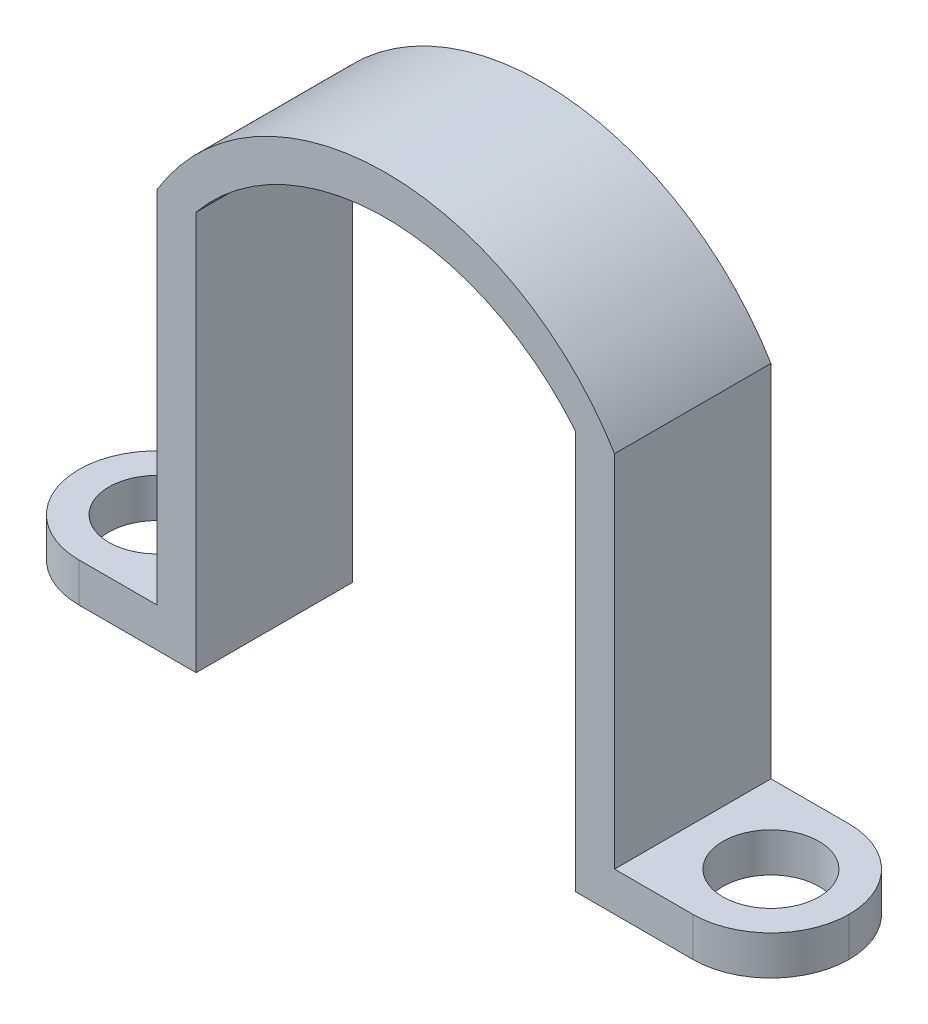
ISO-10303-21;
HEADER;
FILE_DESCRIPTION(('STEP AP214'),'2;1');
FILE_NAME('part.step','',(''),(''),'','','');
FILE_SCHEMA(('AUTOMOTIVE_DESIGN { 1 0 10303 214 1 1 1 1 }'));
ENDSEC;
DATA;
#1=APPLICATION_CONTEXT('core data for automotive mechanical design processes');
#2=APPLICATION_PROTOCOL_DEFINITION('international standard','automotive_design',2000,#1);
#3=PRODUCT_CONTEXT('',#1,'mechanical');
#4=PRODUCT('Part','Part','',(#3));
#5=PRODUCT_RELATED_PRODUCT_CATEGORY('part','',(#4));
#6=PRODUCT_DEFINITION_FORMATION('','',#4);
#7=PRODUCT_DEFINITION_CONTEXT('part definition',#1,'design');
#8=PRODUCT_DEFINITION('design','',#6,#7);
#9=PRODUCT_DEFINITION_SHAPE('','',#8);
#10=(LENGTH_UNIT() NAMED_UNIT(*) SI_UNIT(.MILLI.,.METRE.));
#11=(NAMED_UNIT(*) PLANE_ANGLE_UNIT() SI_UNIT($,.RADIAN.));
#12=(NAMED_UNIT(*) SI_UNIT($,.STERADIAN.) SOLID_ANGLE_UNIT());
#13=UNCERTAINTY_MEASURE_WITH_UNIT(LENGTH_MEASURE(1.E-05),#10,'distance_accuracy_value','');
#14=(GEOMETRIC_REPRESENTATION_CONTEXT(3) GLOBAL_UNCERTAINTY_ASSIGNED_CONTEXT((#13)) GLOBAL_UNIT_ASSIGNED_CONTEXT((#10,
#11,#12)) REPRESENTATION_CONTEXT('',''));
#15=CARTESIAN_POINT('',(0.,0.,0.));
#16=DIRECTION('',(0.,0.,1.));
#17=DIRECTION('',(1.,0.,0.));
#18=AXIS2_PLACEMENT_3D('',#15,#16,#17);
#19=CARTESIAN_POINT('',(18.669,-22.1999604842901,5.08));
#20=DIRECTION('',(0.,-1.,0.));
#21=DIRECTION('',(0.,0.,-1.));
#22=AXIS2_PLACEMENT_3D('',#19,#20,#21);
#23=PLANE('',#22);
#24=CARTESIAN_POINT('',(16.129,-22.1999604842901,2.54));
#25=DIRECTION('',(0.,1.,0.));
#26=DIRECTION('',(0.,0.,1.));
#27=AXIS2_PLACEMENT_3D('',#24,#25,#26);
#28=CIRCLE('',#27,1.5625);
#29=CARTESIAN_POINT('',(16.129,-22.1999604842901,4.1025));
#30=VERTEX_POINT('',#29);
#31=EDGE_CURVE('E247',#30,#30,#28,.T.);
#32=ORIENTED_EDGE('',*,*,#31,.F.);
#33=EDGE_LOOP('',(#32));
#34=FACE_BOUND('',#33,.T.);
#35=CARTESIAN_POINT('',(16.129,-22.1999604842901,2.54));
#36=DIRECTION('',(0.,-1.,0.));
#37=DIRECTION('',(0.,0.,-1.));
#38=AXIS2_PLACEMENT_3D('',#35,#36,#37);
#39=CIRCLE('',#38,2.54);
#40=CARTESIAN_POINT('',(16.129,-22.1999604842901,5.08));
#41=VERTEX_POINT('',#40);
#42=CARTESIAN_POINT('',(18.669,-22.1999604842901,2.54));
#43=VERTEX_POINT('',#42);
#44=EDGE_CURVE('E60',#41,#43,#39,.F.);
#45=ORIENTED_EDGE('',*,*,#44,.T.);
#46=CARTESIAN_POINT('',(16.129,-22.1999604842901,2.54));
#47=DIRECTION('',(0.,-1.,0.));
#48=DIRECTION('',(0.,0.,-1.));
#49=AXIS2_PLACEMENT_3D('',#46,#47,#48);
#50=CIRCLE('',#49,2.54);
#51=CARTESIAN_POINT('',(16.129,-22.1999604842901,0.));
#52=VERTEX_POINT('',#51);
#53=EDGE_CURVE('E236',#43,#52,#50,.F.);
#54=ORIENTED_EDGE('',*,*,#53,.T.);
#55=DIRECTION('',(-1.,0.,0.));
#56=VECTOR('',#55,1.);
#57=CARTESIAN_POINT('',(18.669,-22.1999604842901,0.));
#58=LINE('',#57,#56);
#59=CARTESIAN_POINT('',(13.589,-22.1999604842901,0.));
#60=VERTEX_POINT('',#59);
#61=EDGE_CURVE('E152',#52,#60,#58,.T.);
#62=ORIENTED_EDGE('',*,*,#61,.T.);
#63=DIRECTION('',(0.,0.,-1.));
#64=VECTOR('',#63,1.);
#65=CARTESIAN_POINT('',(13.589,-22.1999604842901,5.08));
#66=LINE('',#65,#64);
#67=CARTESIAN_POINT('',(13.589,-22.1999604842901,5.08));
#68=VERTEX_POINT('',#67);
#69=EDGE_CURVE('E150',#68,#60,#66,.T.);
#70=ORIENTED_EDGE('',*,*,#69,.F.);
#71=DIRECTION('',(-1.,0.,0.));
#72=VECTOR('',#71,1.);
#73=CARTESIAN_POINT('',(18.669,-22.1999604842901,5.08));
#74=LINE('',#73,#72);
#75=EDGE_CURVE('E137',#41,#68,#74,.T.);
#76=ORIENTED_EDGE('',*,*,#75,.F.);
#77=EDGE_LOOP('',(#45,#54,#62,#70,#76));
#78=FACE_BOUND('',#77,.T.);
#79=ADVANCED_FACE('F37',(#34,#78),#23,.F.);
#80=CARTESIAN_POINT('',(13.589,-22.1999604842901,5.08));
#81=DIRECTION('',(-1.,0.,0.));
#82=DIRECTION('',(0.,0.,1.));
#83=AXIS2_PLACEMENT_3D('',#80,#81,#82);
#84=PLANE('',#83);
#85=DIRECTION('',(0.,1.,0.));
#86=VECTOR('',#85,1.);
#87=CARTESIAN_POINT('',(13.589,-22.1999604842901,0.));
#88=LINE('',#87,#86);
#89=CARTESIAN_POINT('',(13.589,-10.5159604842901,0.));
#90=VERTEX_POINT('',#89);
#91=EDGE_CURVE('E182',#60,#90,#88,.T.);
#92=ORIENTED_EDGE('',*,*,#91,.T.);
#93=DIRECTION('',(0.,0.,-1.));
#94=VECTOR('',#93,1.);
#95=CARTESIAN_POINT('',(13.589,-10.5159604842901,5.08));
#96=LINE('',#95,#94);
#97=CARTESIAN_POINT('',(13.589,-10.5159604842901,5.08));
#98=VERTEX_POINT('',#97);
#99=EDGE_CURVE('E156',#98,#90,#96,.T.);
#100=ORIENTED_EDGE('',*,*,#99,.F.);
#101=DIRECTION('',(0.,1.,0.));
#102=VECTOR('',#101,1.);
#103=CARTESIAN_POINT('',(13.589,-22.1999604842901,5.08));
#104=LINE('',#103,#102);
#105=EDGE_CURVE('E142',#68,#98,#104,.T.);
#106=ORIENTED_EDGE('',*,*,#105,.F.);
#107=ORIENTED_EDGE('',*,*,#69,.T.);
#108=EDGE_LOOP('',(#92,#100,#106,#107));
#109=FACE_BOUND('',#108,.T.);
#110=ADVANCED_FACE('F158',(#109),#84,.F.);
#111=CARTESIAN_POINT('',(6.1595,-15.0056991206537,5.08));
#112=DIRECTION('',(0.,0.,-1.));
#113=DIRECTION('',(-1.,0.,0.));
#114=AXIS2_PLACEMENT_3D('',#111,#112,#113);
#115=CYLINDRICAL_SURFACE('',#114,8.68073863636364);
#116=CARTESIAN_POINT('',(6.1595,-15.0056991206537,0.));
#117=DIRECTION('',(0.,0.,1.));
#118=DIRECTION('',(1.,0.,0.));
#119=AXIS2_PLACEMENT_3D('',#116,#117,#118);
#120=CIRCLE('',#119,8.68073863636364);
#121=CARTESIAN_POINT('',(-1.27,-10.5159604842901,0.));
#122=VERTEX_POINT('',#121);
#123=EDGE_CURVE('E185',#90,#122,#120,.T.);
#124=ORIENTED_EDGE('',*,*,#123,.T.);
#125=DIRECTION('',(0.,0.,-1.));
#126=VECTOR('',#125,1.);
#127=CARTESIAN_POINT('',(-1.27,-10.5159604842901,5.08));
#128=LINE('',#127,#126);
#129=CARTESIAN_POINT('',(-1.27,-10.5159604842901,5.08));
#130=VERTEX_POINT('',#129);
#131=EDGE_CURVE('E215',#130,#122,#128,.T.);
#132=ORIENTED_EDGE('',*,*,#131,.F.);
#133=CARTESIAN_POINT('',(6.1595,-15.0056991206537,5.08));
#134=DIRECTION('',(0.,0.,1.));
#135=DIRECTION('',(1.,0.,0.));
#136=AXIS2_PLACEMENT_3D('',#133,#134,#135);
#137=CIRCLE('',#136,8.68073863636364);
#138=EDGE_CURVE('E161',#98,#130,#137,.T.);
#139=ORIENTED_EDGE('',*,*,#138,.F.);
#140=ORIENTED_EDGE('',*,*,#99,.T.);
#141=EDGE_LOOP('',(#124,#132,#139,#140));
#142=FACE_BOUND('',#141,.T.);
#143=ADVANCED_FACE('F291',(#142),#115,.T.);
#144=CARTESIAN_POINT('',(-1.27,-10.5159604842901,5.08));
#145=DIRECTION('',(1.,0.,0.));
#146=DIRECTION('',(0.,1.,0.));
#147=AXIS2_PLACEMENT_3D('',#144,#145,#146);
#148=PLANE('',#147);
#149=DIRECTION('',(0.,-1.,0.));
#150=VECTOR('',#149,1.);
#151=CARTESIAN_POINT('',(-1.27,-10.5159604842901,0.));
#152=LINE('',#151,#150);
#153=CARTESIAN_POINT('',(-1.27,-22.1999604842901,0.));
#154=VERTEX_POINT('',#153);
#155=EDGE_CURVE('E187',#122,#154,#152,.T.);
#156=ORIENTED_EDGE('',*,*,#155,.T.);
#157=DIRECTION('',(0.,0.,-1.));
#158=VECTOR('',#157,1.);
#159=CARTESIAN_POINT('',(-1.27,-22.1999604842901,5.08));
#160=LINE('',#159,#158);
#161=CARTESIAN_POINT('',(-1.27,-22.1999604842901,5.08));
#162=VERTEX_POINT('',#161);
#163=EDGE_CURVE('E212',#162,#154,#160,.T.);
#164=ORIENTED_EDGE('',*,*,#163,.F.);
#165=DIRECTION('',(0.,-1.,0.));
#166=VECTOR('',#165,1.);
#167=CARTESIAN_POINT('',(-1.27,-10.5159604842901,5.08));
#168=LINE('',#167,#166);
#169=EDGE_CURVE('E163',#130,#162,#168,.T.);
#170=ORIENTED_EDGE('',*,*,#169,.F.);
#171=ORIENTED_EDGE('',*,*,#131,.T.);
#172=EDGE_LOOP('',(#156,#164,#170,#171));
#173=FACE_BOUND('',#172,.T.);
#174=ADVANCED_FACE('F266',(#173),#148,.F.);
#175=CARTESIAN_POINT('',(-1.27,-22.1999604842901,5.08));
#176=DIRECTION('',(0.,-1.,0.));
#177=DIRECTION('',(0.,0.,-1.));
#178=AXIS2_PLACEMENT_3D('',#175,#176,#177);
#179=PLANE('',#178);
#180=CARTESIAN_POINT('',(-3.81,-22.1999604842901,2.54));
#181=DIRECTION('',(0.,1.,0.));
#182=DIRECTION('',(0.,0.,1.));
#183=AXIS2_PLACEMENT_3D('',#180,#181,#182);
#184=CIRCLE('',#183,1.56250000000001);
#185=CARTESIAN_POINT('',(-3.81,-22.1999604842901,4.10250000000001));
#186=VERTEX_POINT('',#185);
#187=EDGE_CURVE('E256',#186,#186,#184,.T.);
#188=ORIENTED_EDGE('',*,*,#187,.F.);
#189=EDGE_LOOP('',(#188));
#190=FACE_BOUND('',#189,.T.);
#191=DIRECTION('',(-1.,0.,0.));
#192=VECTOR('',#191,1.);
#193=CARTESIAN_POINT('',(-1.27,-22.1999604842901,0.));
#194=LINE('',#193,#192);
#195=CARTESIAN_POINT('',(-3.81,-22.1999604842901,0.));
#196=VERTEX_POINT('',#195);
#197=EDGE_CURVE('E189',#154,#196,#194,.T.);
#198=ORIENTED_EDGE('',*,*,#197,.T.);
#199=CARTESIAN_POINT('',(-3.81,-22.1999604842901,2.54));
#200=DIRECTION('',(0.,-1.,0.));
#201=DIRECTION('',(0.,0.,-1.));
#202=AXIS2_PLACEMENT_3D('',#199,#200,#201);
#203=CIRCLE('',#202,2.54);
#204=CARTESIAN_POINT('',(-6.35,-22.1999604842901,2.54));
#205=VERTEX_POINT('',#204);
#206=EDGE_CURVE('E230',#196,#205,#203,.F.);
#207=ORIENTED_EDGE('',*,*,#206,.T.);
#208=CARTESIAN_POINT('',(-3.81,-22.1999604842901,2.54));
#209=DIRECTION('',(0.,-1.,0.));
#210=DIRECTION('',(0.,0.,-1.));
#211=AXIS2_PLACEMENT_3D('',#208,#209,#210);
#212=CIRCLE('',#211,2.54);
#213=CARTESIAN_POINT('',(-3.81,-22.1999604842901,5.08));
#214=VERTEX_POINT('',#213);
#215=EDGE_CURVE('E228',#205,#214,#212,.F.);
#216=ORIENTED_EDGE('',*,*,#215,.T.);
#217=DIRECTION('',(-1.,0.,0.));
#218=VECTOR('',#217,1.);
#219=CARTESIAN_POINT('',(-1.27,-22.1999604842901,5.08));
#220=LINE('',#219,#218);
#221=EDGE_CURVE('E168',#162,#214,#220,.T.);
#222=ORIENTED_EDGE('',*,*,#221,.F.);
#223=ORIENTED_EDGE('',*,*,#163,.T.);
#224=EDGE_LOOP('',(#198,#207,#216,#222,#223));
#225=FACE_BOUND('',#224,.T.);
#226=ADVANCED_FACE('F262',(#190,#225),#179,.F.);
#227=CARTESIAN_POINT('',(0.,-23.4699604842901,5.08));
#228=DIRECTION('',(0.,1.,0.));
#229=DIRECTION('',(-1.,0.,0.));
#230=AXIS2_PLACEMENT_3D('',#227,#228,#229);
#231=PLANE('',#230);
#232=CARTESIAN_POINT('',(-3.81,-23.4699604842901,2.54));
#233=DIRECTION('',(0.,1.,0.));
#234=DIRECTION('',(0.,0.,1.));
#235=AXIS2_PLACEMENT_3D('',#232,#233,#234);
#236=CIRCLE('',#235,1.56250000000001);
#237=CARTESIAN_POINT('',(-3.81,-23.4699604842901,4.10250000000001));
#238=VERTEX_POINT('',#237);
#239=EDGE_CURVE('E252',#238,#238,#236,.T.);
#240=ORIENTED_EDGE('',*,*,#239,.T.);
#241=EDGE_LOOP('',(#240));
#242=FACE_BOUND('',#241,.T.);
#243=CARTESIAN_POINT('',(-3.80999999999999,-23.4699604842901,2.54));
#244=DIRECTION('',(0.,1.,0.));
#245=DIRECTION('',(-1.,0.,0.));
#246=AXIS2_PLACEMENT_3D('',#243,#244,#245);
#247=CIRCLE('',#246,2.54);
#248=CARTESIAN_POINT('',(-3.80999999999999,-23.4699604842901,5.08));
#249=VERTEX_POINT('',#248);
#250=CARTESIAN_POINT('',(-6.34999999999999,-23.4699604842901,2.54));
#251=VERTEX_POINT('',#250);
#252=EDGE_CURVE('E155',#249,#251,#247,.F.);
#253=ORIENTED_EDGE('',*,*,#252,.T.);
#254=CARTESIAN_POINT('',(-3.80999999999999,-23.4699604842901,2.54));
#255=DIRECTION('',(0.,1.,0.));
#256=DIRECTION('',(-1.,0.,0.));
#257=AXIS2_PLACEMENT_3D('',#254,#255,#256);
#258=CIRCLE('',#257,2.54);
#259=CARTESIAN_POINT('',(-3.80999999999999,-23.4699604842901,0.));
#260=VERTEX_POINT('',#259);
#261=EDGE_CURVE('E220',#251,#260,#258,.F.);
#262=ORIENTED_EDGE('',*,*,#261,.T.);
#263=DIRECTION('',(1.,0.,0.));
#264=VECTOR('',#263,1.);
#265=CARTESIAN_POINT('',(0.,-23.4699604842901,0.));
#266=LINE('',#265,#264);
#267=CARTESIAN_POINT('',(0.,-23.4699604842901,0.));
#268=VERTEX_POINT('',#267);
#269=EDGE_CURVE('E192',#260,#268,#266,.T.);
#270=ORIENTED_EDGE('',*,*,#269,.T.);
#271=DIRECTION('',(0.,0.,-1.));
#272=VECTOR('',#271,1.);
#273=CARTESIAN_POINT('',(0.,-23.4699604842901,5.08));
#274=LINE('',#273,#272);
#275=CARTESIAN_POINT('',(0.,-23.4699604842901,5.08));
#276=VERTEX_POINT('',#275);
#277=EDGE_CURVE('E209',#276,#268,#274,.T.);
#278=ORIENTED_EDGE('',*,*,#277,.F.);
#279=DIRECTION('',(1.,0.,0.));
#280=VECTOR('',#279,1.);
#281=CARTESIAN_POINT('',(0.,-23.4699604842901,5.08));
#282=LINE('',#281,#280);
#283=EDGE_CURVE('E170',#249,#276,#282,.T.);
#284=ORIENTED_EDGE('',*,*,#283,.F.);
#285=EDGE_LOOP('',(#253,#262,#270,#278,#284));
#286=FACE_BOUND('',#285,.T.);
#287=ADVANCED_FACE('F265',(#242,#286),#231,.F.);
#288=CARTESIAN_POINT('',(0.,-10.5159604842901,5.08));
#289=DIRECTION('',(-1.,0.,0.));
#290=DIRECTION('',(0.,-1.,0.));
#291=AXIS2_PLACEMENT_3D('',#288,#289,#290);
#292=PLANE('',#291);
#293=DIRECTION('',(0.,1.,0.));
#294=VECTOR('',#293,1.);
#295=CARTESIAN_POINT('',(0.,-10.5159604842901,0.));
#296=LINE('',#295,#294);
#297=CARTESIAN_POINT('',(0.,-10.5159604842901,0.));
#298=VERTEX_POINT('',#297);
#299=EDGE_CURVE('E194',#268,#298,#296,.T.);
#300=ORIENTED_EDGE('',*,*,#299,.T.);
#301=DIRECTION('',(0.,0.,-1.));
#302=VECTOR('',#301,1.);
#303=CARTESIAN_POINT('',(0.,-10.5159604842901,5.08));
#304=LINE('',#303,#302);
#305=CARTESIAN_POINT('',(0.,-10.5159604842901,5.08));
#306=VERTEX_POINT('',#305);
#307=EDGE_CURVE('E206',#306,#298,#304,.T.);
#308=ORIENTED_EDGE('',*,*,#307,.F.);
#309=DIRECTION('',(0.,1.,0.));
#310=VECTOR('',#309,1.);
#311=CARTESIAN_POINT('',(0.,-10.5159604842901,5.08));
#312=LINE('',#311,#310);
#313=EDGE_CURVE('E172',#276,#306,#312,.T.);
#314=ORIENTED_EDGE('',*,*,#313,.F.);
#315=ORIENTED_EDGE('',*,*,#277,.T.);
#316=EDGE_LOOP('',(#300,#308,#314,#315));
#317=FACE_BOUND('',#316,.T.);
#318=ADVANCED_FACE('F337',(#317),#292,.F.);
#319=CARTESIAN_POINT('',(6.1595,-15.5497159190727,5.08));
#320=DIRECTION('',(0.,0.,-1.));
#321=DIRECTION('',(-1.,0.,0.));
#322=AXIS2_PLACEMENT_3D('',#319,#320,#321);
#323=CYLINDRICAL_SURFACE('',#322,7.95475543478261);
#324=CARTESIAN_POINT('',(6.1595,-15.5497159190727,0.));
#325=DIRECTION('',(0.,0.,-1.));
#326=DIRECTION('',(1.,0.,0.));
#327=AXIS2_PLACEMENT_3D('',#324,#325,#326);
#328=CIRCLE('',#327,7.95475543478261);
#329=CARTESIAN_POINT('',(12.319,-10.5159604842901,0.));
#330=VERTEX_POINT('',#329);
#331=EDGE_CURVE('E196',#298,#330,#328,.T.);
#332=ORIENTED_EDGE('',*,*,#331,.T.);
#333=DIRECTION('',(0.,0.,-1.));
#334=VECTOR('',#333,1.);
#335=CARTESIAN_POINT('',(12.319,-10.5159604842901,5.08));
#336=LINE('',#335,#334);
#337=CARTESIAN_POINT('',(12.319,-10.5159604842901,5.08));
#338=VERTEX_POINT('',#337);
#339=EDGE_CURVE('E203',#338,#330,#336,.T.);
#340=ORIENTED_EDGE('',*,*,#339,.F.);
#341=CARTESIAN_POINT('',(6.1595,-15.5497159190727,5.08));
#342=DIRECTION('',(0.,0.,-1.));
#343=DIRECTION('',(1.,0.,0.));
#344=AXIS2_PLACEMENT_3D('',#341,#342,#343);
#345=CIRCLE('',#344,7.95475543478261);
#346=EDGE_CURVE('E174',#306,#338,#345,.T.);
#347=ORIENTED_EDGE('',*,*,#346,.F.);
#348=ORIENTED_EDGE('',*,*,#307,.T.);
#349=EDGE_LOOP('',(#332,#340,#347,#348));
#350=FACE_BOUND('',#349,.T.);
#351=ADVANCED_FACE('F333',(#350),#323,.F.);
#352=CARTESIAN_POINT('',(12.319,-23.4699604842901,5.08));
#353=DIRECTION('',(1.,0.,0.));
#354=DIRECTION('',(0.,0.,-1.));
#355=AXIS2_PLACEMENT_3D('',#352,#353,#354);
#356=PLANE('',#355);
#357=DIRECTION('',(0.,-1.,0.));
#358=VECTOR('',#357,1.);
#359=CARTESIAN_POINT('',(12.319,-23.4699604842901,0.));
#360=LINE('',#359,#358);
#361=CARTESIAN_POINT('',(12.319,-23.4699604842901,0.));
#362=VERTEX_POINT('',#361);
#363=EDGE_CURVE('E198',#330,#362,#360,.T.);
#364=ORIENTED_EDGE('',*,*,#363,.T.);
#365=DIRECTION('',(0.,0.,-1.));
#366=VECTOR('',#365,1.);
#367=CARTESIAN_POINT('',(12.319,-23.4699604842901,5.08));
#368=LINE('',#367,#366);
#369=CARTESIAN_POINT('',(12.319,-23.4699604842901,5.08));
#370=VERTEX_POINT('',#369);
#371=EDGE_CURVE('E180',#370,#362,#368,.T.);
#372=ORIENTED_EDGE('',*,*,#371,.F.);
#373=DIRECTION('',(0.,-1.,0.));
#374=VECTOR('',#373,1.);
#375=CARTESIAN_POINT('',(12.319,-23.4699604842901,5.08));
#376=LINE('',#375,#374);
#377=EDGE_CURVE('E176',#338,#370,#376,.T.);
#378=ORIENTED_EDGE('',*,*,#377,.F.);
#379=ORIENTED_EDGE('',*,*,#339,.T.);
#380=EDGE_LOOP('',(#364,#372,#378,#379));
#381=FACE_BOUND('',#380,.T.);
#382=ADVANCED_FACE('F330',(#381),#356,.F.);
#383=CARTESIAN_POINT('',(18.669,-23.4699604842901,5.08));
#384=DIRECTION('',(0.,1.,0.));
#385=DIRECTION('',(-1.,0.,0.));
#386=AXIS2_PLACEMENT_3D('',#383,#384,#385);
#387=PLANE('',#386);
#388=CARTESIAN_POINT('',(16.129,-23.4699604842901,2.54));
#389=DIRECTION('',(0.,1.,0.));
#390=DIRECTION('',(0.,0.,1.));
#391=AXIS2_PLACEMENT_3D('',#388,#389,#390);
#392=CIRCLE('',#391,1.5625);
#393=CARTESIAN_POINT('',(16.129,-23.4699604842901,4.1025));
#394=VERTEX_POINT('',#393);
#395=EDGE_CURVE('E243',#394,#394,#392,.T.);
#396=ORIENTED_EDGE('',*,*,#395,.T.);
#397=EDGE_LOOP('',(#396));
#398=FACE_BOUND('',#397,.T.);
#399=DIRECTION('',(1.,0.,0.));
#400=VECTOR('',#399,1.);
#401=CARTESIAN_POINT('',(18.669,-23.4699604842901,0.));
#402=LINE('',#401,#400);
#403=CARTESIAN_POINT('',(16.129,-23.4699604842901,0.));
#404=VERTEX_POINT('',#403);
#405=EDGE_CURVE('E147',#362,#404,#402,.T.);
#406=ORIENTED_EDGE('',*,*,#405,.T.);
#407=CARTESIAN_POINT('',(16.129,-23.4699604842901,2.54));
#408=DIRECTION('',(0.,1.,0.));
#409=DIRECTION('',(-1.,0.,0.));
#410=AXIS2_PLACEMENT_3D('',#407,#408,#409);
#411=CIRCLE('',#410,2.54);
#412=CARTESIAN_POINT('',(18.669,-23.4699604842901,2.54));
#413=VERTEX_POINT('',#412);
#414=EDGE_CURVE('E11',#404,#413,#411,.F.);
#415=ORIENTED_EDGE('',*,*,#414,.T.);
#416=CARTESIAN_POINT('',(16.129,-23.4699604842901,2.54));
#417=DIRECTION('',(0.,1.,0.));
#418=DIRECTION('',(-1.,0.,0.));
#419=AXIS2_PLACEMENT_3D('',#416,#417,#418);
#420=CIRCLE('',#419,2.54);
#421=CARTESIAN_POINT('',(16.129,-23.4699604842901,5.08));
#422=VERTEX_POINT('',#421);
#423=EDGE_CURVE('E46',#413,#422,#420,.F.);
#424=ORIENTED_EDGE('',*,*,#423,.T.);
#425=DIRECTION('',(1.,0.,0.));
#426=VECTOR('',#425,1.);
#427=CARTESIAN_POINT('',(18.669,-23.4699604842901,5.08));
#428=LINE('',#427,#426);
#429=EDGE_CURVE('E178',#370,#422,#428,.T.);
#430=ORIENTED_EDGE('',*,*,#429,.F.);
#431=ORIENTED_EDGE('',*,*,#371,.T.);
#432=EDGE_LOOP('',(#406,#415,#424,#430,#431));
#433=FACE_BOUND('',#432,.T.);
#434=ADVANCED_FACE('F324',(#398,#433),#387,.F.);
#435=CARTESIAN_POINT('',(6.1595,-15.0056991206537,5.08));
#436=DIRECTION('',(0.,0.,1.));
#437=DIRECTION('',(1.,0.,0.));
#438=AXIS2_PLACEMENT_3D('',#435,#436,#437);
#439=PLANE('',#438);
#440=ORIENTED_EDGE('',*,*,#221,.T.);
#441=DIRECTION('',(0.,-1.,0.));
#442=VECTOR('',#441,1.);
#443=CARTESIAN_POINT('',(-3.80999999999999,-23.46996048429,5.08));
#444=LINE('',#443,#442);
#445=EDGE_CURVE('E233',#214,#249,#444,.T.);
#446=ORIENTED_EDGE('',*,*,#445,.T.);
#447=ORIENTED_EDGE('',*,*,#283,.T.);
#448=ORIENTED_EDGE('',*,*,#313,.T.);
#449=ORIENTED_EDGE('',*,*,#346,.T.);
#450=ORIENTED_EDGE('',*,*,#377,.T.);
#451=ORIENTED_EDGE('',*,*,#429,.T.);
#452=DIRECTION('',(0.,1.,0.));
#453=VECTOR('',#452,1.);
#454=CARTESIAN_POINT('',(16.129,-22.19996048429,5.08));
#455=LINE('',#454,#453);
#456=EDGE_CURVE('E146',#422,#41,#455,.T.);
#457=ORIENTED_EDGE('',*,*,#456,.T.);
#458=ORIENTED_EDGE('',*,*,#75,.T.);
#459=ORIENTED_EDGE('',*,*,#105,.T.);
#460=ORIENTED_EDGE('',*,*,#138,.T.);
#461=ORIENTED_EDGE('',*,*,#169,.T.);
#462=EDGE_LOOP('',(#440,#446,#447,#448,#449,#450,#451,#457,#458,#459,#460,#461));
#463=FACE_BOUND('',#462,.T.);
#464=ADVANCED_FACE('F140',(#463),#439,.T.);
#465=CARTESIAN_POINT('',(6.1595,-15.0056991206537,0.));
#466=DIRECTION('',(0.,0.,1.));
#467=DIRECTION('',(1.,0.,0.));
#468=AXIS2_PLACEMENT_3D('',#465,#466,#467);
#469=PLANE('',#468);
#470=ORIENTED_EDGE('',*,*,#269,.F.);
#471=DIRECTION('',(0.,-1.,0.));
#472=VECTOR('',#471,1.);
#473=CARTESIAN_POINT('',(-3.81000000000004,-15.0056991206538,0.));
#474=LINE('',#473,#472);
#475=EDGE_CURVE('E225',#260,#196,#474,.F.);
#476=ORIENTED_EDGE('',*,*,#475,.T.);
#477=ORIENTED_EDGE('',*,*,#197,.F.);
#478=ORIENTED_EDGE('',*,*,#155,.F.);
#479=ORIENTED_EDGE('',*,*,#123,.F.);
#480=ORIENTED_EDGE('',*,*,#91,.F.);
#481=ORIENTED_EDGE('',*,*,#61,.F.);
#482=DIRECTION('',(0.,1.,0.));
#483=VECTOR('',#482,1.);
#484=CARTESIAN_POINT('',(16.129,-15.0056991206538,0.));
#485=LINE('',#484,#483);
#486=EDGE_CURVE('E222',#52,#404,#485,.F.);
#487=ORIENTED_EDGE('',*,*,#486,.T.);
#488=ORIENTED_EDGE('',*,*,#405,.F.);
#489=ORIENTED_EDGE('',*,*,#363,.F.);
#490=ORIENTED_EDGE('',*,*,#331,.F.);
#491=ORIENTED_EDGE('',*,*,#299,.F.);
#492=EDGE_LOOP('',(#470,#476,#477,#478,#479,#480,#481,#487,#488,#489,#490,#491));
#493=FACE_BOUND('',#492,.T.);
#494=ADVANCED_FACE('F275',(#493),#469,.F.);
#495=CARTESIAN_POINT('',(-3.81000000000004,-15.0056991206538,2.54));
#496=DIRECTION('',(0.,1.,0.));
#497=DIRECTION('',(-1.,0.,0.));
#498=AXIS2_PLACEMENT_3D('',#495,#496,#497);
#499=CYLINDRICAL_SURFACE('',#498,2.54);
#500=ORIENTED_EDGE('',*,*,#445,.F.);
#501=ORIENTED_EDGE('',*,*,#215,.F.);
#502=DIRECTION('',(0.,-1.,0.));
#503=VECTOR('',#502,1.);
#504=CARTESIAN_POINT('',(-6.35,-22.1999604842901,2.54));
#505=LINE('',#504,#503);
#506=EDGE_CURVE('E183',#251,#205,#505,.F.);
#507=ORIENTED_EDGE('',*,*,#506,.F.);
#508=ORIENTED_EDGE('',*,*,#252,.F.);
#509=EDGE_LOOP('',(#500,#501,#507,#508));
#510=FACE_BOUND('',#509,.T.);
#511=ADVANCED_FACE('F286',(#510),#499,.T.);
#512=CARTESIAN_POINT('',(-3.80999999999999,-23.46996048429,2.54));
#513=DIRECTION('',(0.,-1.,0.));
#514=DIRECTION('',(1.,0.,0.));
#515=AXIS2_PLACEMENT_3D('',#512,#513,#514);
#516=CYLINDRICAL_SURFACE('',#515,2.54);
#517=ORIENTED_EDGE('',*,*,#206,.F.);
#518=ORIENTED_EDGE('',*,*,#475,.F.);
#519=ORIENTED_EDGE('',*,*,#261,.F.);
#520=ORIENTED_EDGE('',*,*,#506,.T.);
#521=EDGE_LOOP('',(#517,#518,#519,#520));
#522=FACE_BOUND('',#521,.T.);
#523=ADVANCED_FACE('F279',(#522),#516,.T.);
#524=CARTESIAN_POINT('',(16.129,-15.0056991206538,2.54));
#525=DIRECTION('',(0.,-1.,0.));
#526=DIRECTION('',(1.,0.,0.));
#527=AXIS2_PLACEMENT_3D('',#524,#525,#526);
#528=CYLINDRICAL_SURFACE('',#527,2.54);
#529=ORIENTED_EDGE('',*,*,#456,.F.);
#530=ORIENTED_EDGE('',*,*,#423,.F.);
#531=DIRECTION('',(0.,1.,0.));
#532=VECTOR('',#531,1.);
#533=CARTESIAN_POINT('',(18.669,-23.4699604842901,2.54));
#534=LINE('',#533,#532);
#535=EDGE_CURVE('E41',#43,#413,#534,.F.);
#536=ORIENTED_EDGE('',*,*,#535,.F.);
#537=ORIENTED_EDGE('',*,*,#44,.F.);
#538=EDGE_LOOP('',(#529,#530,#536,#537));
#539=FACE_BOUND('',#538,.T.);
#540=ADVANCED_FACE('F39',(#539),#528,.T.);
#541=CARTESIAN_POINT('',(16.129,-23.46996048429,2.54));
#542=DIRECTION('',(0.,1.,0.));
#543=DIRECTION('',(-1.,0.,0.));
#544=AXIS2_PLACEMENT_3D('',#541,#542,#543);
#545=CYLINDRICAL_SURFACE('',#544,2.54);
#546=ORIENTED_EDGE('',*,*,#414,.F.);
#547=ORIENTED_EDGE('',*,*,#486,.F.);
#548=ORIENTED_EDGE('',*,*,#53,.F.);
#549=ORIENTED_EDGE('',*,*,#535,.T.);
#550=EDGE_LOOP('',(#546,#547,#548,#549));
#551=FACE_BOUND('',#550,.T.);
#552=ADVANCED_FACE('F294',(#551),#545,.T.);
#553=CARTESIAN_POINT('',(16.129,-23.4699604842901,2.54));
#554=DIRECTION('',(0.,1.,0.));
#555=DIRECTION('',(0.,0.,1.));
#556=AXIS2_PLACEMENT_3D('',#553,#554,#555);
#557=CYLINDRICAL_SURFACE('',#556,1.5625);
#558=ORIENTED_EDGE('',*,*,#395,.F.);
#559=EDGE_LOOP('',(#558));
#560=FACE_BOUND('',#559,.T.);
#561=ORIENTED_EDGE('',*,*,#31,.T.);
#562=EDGE_LOOP('',(#561));
#563=FACE_BOUND('',#562,.T.);
#564=ADVANCED_FACE('F296',(#560,#563),#557,.F.);
#565=CARTESIAN_POINT('',(-3.81,-23.4699604842901,2.54));
#566=DIRECTION('',(0.,1.,0.));
#567=DIRECTION('',(0.,0.,1.));
#568=AXIS2_PLACEMENT_3D('',#565,#566,#567);
#569=CYLINDRICAL_SURFACE('',#568,1.56250000000001);
#570=ORIENTED_EDGE('',*,*,#239,.F.);
#571=EDGE_LOOP('',(#570));
#572=FACE_BOUND('',#571,.T.);
#573=ORIENTED_EDGE('',*,*,#187,.T.);
#574=EDGE_LOOP('',(#573));
#575=FACE_BOUND('',#574,.T.);
#576=ADVANCED_FACE('F260',(#572,#575),#569,.F.);
#577=CLOSED_SHELL('',(#79,#110,#143,#174,#226,#287,#318,#351,#382,#434,#464,#494,#511,#523,#540,
#552,#564,#576));
#578=MANIFOLD_SOLID_BREP('B2',#577);
#579=ADVANCED_BREP_SHAPE_REPRESENTATION('',(#18,#578),#14);
#580=SHAPE_DEFINITION_REPRESENTATION(#9,#579);
ENDSEC;
END-ISO-10303-21;
